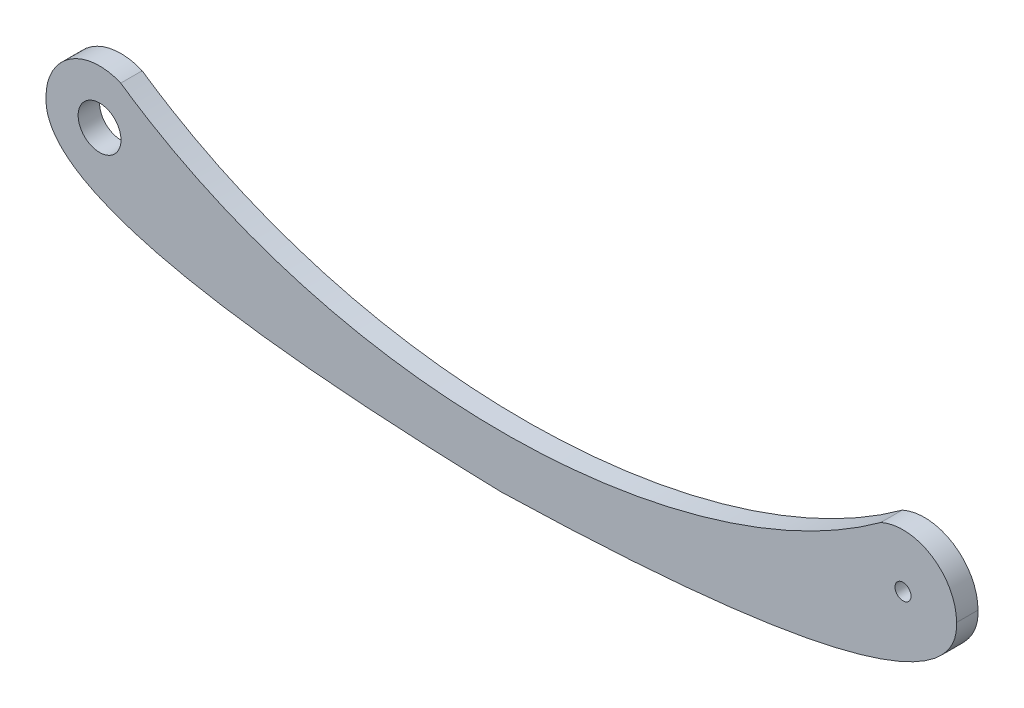
ISO-10303-21;
HEADER;
FILE_DESCRIPTION(('STEP AP214'),'2;1');
FILE_NAME('part.step','',(''),(''),'','','');
FILE_SCHEMA(('AUTOMOTIVE_DESIGN { 1 0 10303 214 1 1 1 1 }'));
ENDSEC;
DATA;
#1=APPLICATION_CONTEXT('core data for automotive mechanical design processes');
#2=APPLICATION_PROTOCOL_DEFINITION('international standard','automotive_design',2000,#1);
#3=PRODUCT_CONTEXT('',#1,'mechanical');
#4=PRODUCT('Part','Part','',(#3));
#5=PRODUCT_RELATED_PRODUCT_CATEGORY('part','',(#4));
#6=PRODUCT_DEFINITION_FORMATION('','',#4);
#7=PRODUCT_DEFINITION_CONTEXT('part definition',#1,'design');
#8=PRODUCT_DEFINITION('design','',#6,#7);
#9=PRODUCT_DEFINITION_SHAPE('','',#8);
#10=(LENGTH_UNIT() NAMED_UNIT(*) SI_UNIT(.MILLI.,.METRE.));
#11=(NAMED_UNIT(*) PLANE_ANGLE_UNIT() SI_UNIT($,.RADIAN.));
#12=(NAMED_UNIT(*) SI_UNIT($,.STERADIAN.) SOLID_ANGLE_UNIT());
#13=UNCERTAINTY_MEASURE_WITH_UNIT(LENGTH_MEASURE(1.E-05),#10,'distance_accuracy_value','');
#14=(GEOMETRIC_REPRESENTATION_CONTEXT(3) GLOBAL_UNCERTAINTY_ASSIGNED_CONTEXT((#13)) GLOBAL_UNIT_ASSIGNED_CONTEXT((#10,
#11,#12)) REPRESENTATION_CONTEXT('',''));
#15=CARTESIAN_POINT('',(0.,0.,0.));
#16=DIRECTION('',(0.,0.,1.));
#17=DIRECTION('',(1.,0.,0.));
#18=AXIS2_PLACEMENT_3D('',#15,#16,#17);
#19=CARTESIAN_POINT('',(10.8048928814692,-14.9181599133934,4.));
#20=DIRECTION('',(0.,0.,-1.));
#21=DIRECTION('',(-1.,0.,0.));
#22=AXIS2_PLACEMENT_3D('',#19,#20,#21);
#23=PLANE('',#22);
#24=CARTESIAN_POINT('',(-9.99999999999674,0.,4.));
#25=CARTESIAN_POINT('',(-10.8902142370632,-19.1353413607899,4.));
#26=CARTESIAN_POINT('',(75.0000000000002,-21.4019569319938,4.));
#27=B_SPLINE_CURVE_WITH_KNOTS('',2,(#24,#25,#26),.UNSPECIFIED.,.F.,.F.,(3,3),(0.,1.),.UNSPECIFIED.);
#28=CARTESIAN_POINT('',(-9.99999999999674,0.,4.));
#29=VERTEX_POINT('',#28);
#30=CARTESIAN_POINT('',(74.9999999999998,-21.4019569319938,4.));
#31=VERTEX_POINT('',#30);
#32=EDGE_CURVE('E128',#29,#31,#27,.T.);
#33=ORIENTED_EDGE('',*,*,#32,.T.);
#34=CARTESIAN_POINT('',(74.9999999999998,-21.4019569319938,4.));
#35=CARTESIAN_POINT('',(160.890214237063,-19.1353413607899,4.));
#36=CARTESIAN_POINT('',(159.999999999997,0.,4.));
#37=B_SPLINE_CURVE_WITH_KNOTS('',2,(#34,#35,#36),.UNSPECIFIED.,.F.,.F.,(3,3),(0.,1.),.UNSPECIFIED.);
#38=CARTESIAN_POINT('',(159.999999999997,0.,4.));
#39=VERTEX_POINT('',#38);
#40=EDGE_CURVE('E86',#31,#39,#37,.T.);
#41=ORIENTED_EDGE('',*,*,#40,.T.);
#42=CARTESIAN_POINT('',(150.,0.,4.));
#43=DIRECTION('',(0.,0.,1.));
#44=DIRECTION('',(1.,0.,0.));
#45=AXIS2_PLACEMENT_3D('',#42,#43,#44);
#46=CIRCLE('',#45,9.99999999999674);
#47=CARTESIAN_POINT('',(145.865990445887,9.10549092616315,4.));
#48=VERTEX_POINT('',#47);
#49=EDGE_CURVE('E90',#39,#48,#46,.T.);
#50=ORIENTED_EDGE('',*,*,#49,.T.);
#51=CARTESIAN_POINT('',(145.865990445887,9.10549092616315,4.));
#52=CARTESIAN_POINT('',(110.551742639104,-16.7070402195439,4.));
#53=CARTESIAN_POINT('',(46.9064884555261,-20.3737462545654,4.));
#54=CARTESIAN_POINT('',(3.94804782574258,9.18765031798577,4.));
#55=B_SPLINE_CURVE_WITH_KNOTS('',3,(#51,#52,#53,#54),.UNSPECIFIED.,.F.,.F.,(4,4),
(0.0224489478043279,0.850781245648387),.UNSPECIFIED.);
#56=CARTESIAN_POINT('',(3.94804782574258,9.18765031798577,4.));
#57=VERTEX_POINT('',#56);
#58=EDGE_CURVE('E94',#48,#57,#55,.T.);
#59=ORIENTED_EDGE('',*,*,#58,.T.);
#60=CARTESIAN_POINT('',(0.,0.,4.));
#61=DIRECTION('',(0.,0.,1.));
#62=DIRECTION('',(1.,0.,0.));
#63=AXIS2_PLACEMENT_3D('',#60,#61,#62);
#64=CIRCLE('',#63,9.99999999999674);
#65=EDGE_CURVE('E52',#57,#29,#64,.T.);
#66=ORIENTED_EDGE('',*,*,#65,.T.);
#67=EDGE_LOOP('',(#33,#41,#50,#59,#66));
#68=FACE_BOUND('',#67,.T.);
#69=CARTESIAN_POINT('',(0.,0.,4.));
#70=DIRECTION('',(0.,0.,1.));
#71=DIRECTION('',(1.,0.,0.));
#72=AXIS2_PLACEMENT_3D('',#69,#70,#71);
#73=CIRCLE('',#72,4.);
#74=CARTESIAN_POINT('',(4.,0.,4.));
#75=VERTEX_POINT('',#74);
#76=EDGE_CURVE('E142',#75,#75,#73,.T.);
#77=ORIENTED_EDGE('',*,*,#76,.F.);
#78=EDGE_LOOP('',(#77));
#79=FACE_BOUND('',#78,.T.);
#80=CARTESIAN_POINT('',(150.,0.,4.));
#81=DIRECTION('',(0.,0.,1.));
#82=DIRECTION('',(1.,0.,0.));
#83=AXIS2_PLACEMENT_3D('',#80,#81,#82);
#84=CIRCLE('',#83,1.5);
#85=CARTESIAN_POINT('',(151.5,0.,4.));
#86=VERTEX_POINT('',#85);
#87=EDGE_CURVE('E143',#86,#86,#84,.T.);
#88=ORIENTED_EDGE('',*,*,#87,.F.);
#89=EDGE_LOOP('',(#88));
#90=FACE_BOUND('',#89,.T.);
#91=ADVANCED_FACE('F34',(#68,#79,#90),#23,.F.);
#92=CARTESIAN_POINT('',(10.8048928814692,-14.9181599133934,0.));
#93=DIRECTION('',(0.,0.,-1.));
#94=DIRECTION('',(-1.,0.,0.));
#95=AXIS2_PLACEMENT_3D('',#92,#93,#94);
#96=PLANE('',#95);
#97=CARTESIAN_POINT('',(0.,0.,0.));
#98=DIRECTION('',(0.,0.,1.));
#99=DIRECTION('',(1.,0.,0.));
#100=AXIS2_PLACEMENT_3D('',#97,#98,#99);
#101=CIRCLE('',#100,4.);
#102=CARTESIAN_POINT('',(4.,0.,0.));
#103=VERTEX_POINT('',#102);
#104=EDGE_CURVE('E136',#103,#103,#101,.T.);
#105=ORIENTED_EDGE('',*,*,#104,.T.);
#106=EDGE_LOOP('',(#105));
#107=FACE_BOUND('',#106,.T.);
#108=CARTESIAN_POINT('',(-9.99999999999674,0.,0.));
#109=CARTESIAN_POINT('',(-10.8902142370632,-19.1353413607899,0.));
#110=CARTESIAN_POINT('',(75.0000000000002,-21.4019569319938,0.));
#111=B_SPLINE_CURVE_WITH_KNOTS('',2,(#108,#109,#110),.UNSPECIFIED.,.F.,.F.,(3,3),(0.,1.),.UNSPECIFIED.);
#112=CARTESIAN_POINT('',(-9.99999999999674,0.,0.));
#113=VERTEX_POINT('',#112);
#114=CARTESIAN_POINT('',(74.9999999999998,-21.4019569319938,0.));
#115=VERTEX_POINT('',#114);
#116=EDGE_CURVE('E146',#113,#115,#111,.T.);
#117=ORIENTED_EDGE('',*,*,#116,.F.);
#118=CARTESIAN_POINT('',(0.,0.,0.));
#119=DIRECTION('',(0.,0.,1.));
#120=DIRECTION('',(1.,0.,0.));
#121=AXIS2_PLACEMENT_3D('',#118,#119,#120);
#122=CIRCLE('',#121,9.99999999999674);
#123=CARTESIAN_POINT('',(3.94804782574258,9.18765031798577,0.));
#124=VERTEX_POINT('',#123);
#125=EDGE_CURVE('E78',#124,#113,#122,.T.);
#126=ORIENTED_EDGE('',*,*,#125,.F.);
#127=CARTESIAN_POINT('',(145.865990445887,9.10549092616315,0.));
#128=CARTESIAN_POINT('',(110.551742639104,-16.7070402195439,0.));
#129=CARTESIAN_POINT('',(46.9064884555261,-20.3737462545654,0.));
#130=CARTESIAN_POINT('',(3.94804782574258,9.18765031798577,0.));
#131=B_SPLINE_CURVE_WITH_KNOTS('',3,(#127,#128,#129,#130),.UNSPECIFIED.,.F.,.F.,(4,4),
(0.0224489478043279,0.850781245648387),.UNSPECIFIED.);
#132=CARTESIAN_POINT('',(145.865990445887,9.10549092616315,0.));
#133=VERTEX_POINT('',#132);
#134=EDGE_CURVE('E72',#133,#124,#131,.T.);
#135=ORIENTED_EDGE('',*,*,#134,.F.);
#136=CARTESIAN_POINT('',(150.,0.,0.));
#137=DIRECTION('',(0.,0.,1.));
#138=DIRECTION('',(1.,0.,0.));
#139=AXIS2_PLACEMENT_3D('',#136,#137,#138);
#140=CIRCLE('',#139,9.99999999999674);
#141=CARTESIAN_POINT('',(159.999999999997,0.,0.));
#142=VERTEX_POINT('',#141);
#143=EDGE_CURVE('E101',#142,#133,#140,.T.);
#144=ORIENTED_EDGE('',*,*,#143,.F.);
#145=CARTESIAN_POINT('',(74.9999999999998,-21.4019569319938,0.));
#146=CARTESIAN_POINT('',(160.890214237063,-19.1353413607899,0.));
#147=CARTESIAN_POINT('',(159.999999999997,0.,0.));
#148=B_SPLINE_CURVE_WITH_KNOTS('',2,(#145,#146,#147),.UNSPECIFIED.,.F.,.F.,(3,3),(0.,1.),.UNSPECIFIED.);
#149=EDGE_CURVE('E229',#115,#142,#148,.T.);
#150=ORIENTED_EDGE('',*,*,#149,.F.);
#151=EDGE_LOOP('',(#117,#126,#135,#144,#150));
#152=FACE_BOUND('',#151,.T.);
#153=CARTESIAN_POINT('',(150.,0.,0.));
#154=DIRECTION('',(0.,0.,1.));
#155=DIRECTION('',(1.,0.,0.));
#156=AXIS2_PLACEMENT_3D('',#153,#154,#155);
#157=CIRCLE('',#156,1.5);
#158=CARTESIAN_POINT('',(151.5,0.,0.));
#159=VERTEX_POINT('',#158);
#160=EDGE_CURVE('E147',#159,#159,#157,.T.);
#161=ORIENTED_EDGE('',*,*,#160,.T.);
#162=EDGE_LOOP('',(#161));
#163=FACE_BOUND('',#162,.T.);
#164=ADVANCED_FACE('F157',(#107,#152,#163),#96,.T.);
#165=DIRECTION('',(0.,0.,-1.));
#166=VECTOR('',#165,1.);
#167=SURFACE_OF_LINEAR_EXTRUSION('',#27,#166);
#168=ORIENTED_EDGE('',*,*,#116,.T.);
#169=DIRECTION('',(0.,0.,-1.));
#170=VECTOR('',#169,1.);
#171=CARTESIAN_POINT('',(74.9999999999998,-21.4019569319938,4.));
#172=LINE('',#171,#170);
#173=EDGE_CURVE('E11',#31,#115,#172,.T.);
#174=ORIENTED_EDGE('',*,*,#173,.F.);
#175=ORIENTED_EDGE('',*,*,#32,.F.);
#176=DIRECTION('',(0.,0.,-1.));
#177=VECTOR('',#176,1.);
#178=CARTESIAN_POINT('',(-9.99999999999674,0.,4.));
#179=LINE('',#178,#177);
#180=EDGE_CURVE('E106',#29,#113,#179,.T.);
#181=ORIENTED_EDGE('',*,*,#180,.T.);
#182=EDGE_LOOP('',(#168,#174,#175,#181));
#183=FACE_BOUND('',#182,.T.);
#184=ADVANCED_FACE('F36',(#183),#167,.F.);
#185=DIRECTION('',(0.,0.,-1.));
#186=VECTOR('',#185,1.);
#187=SURFACE_OF_LINEAR_EXTRUSION('',#37,#186);
#188=ORIENTED_EDGE('',*,*,#149,.T.);
#189=DIRECTION('',(0.,0.,-1.));
#190=VECTOR('',#189,1.);
#191=CARTESIAN_POINT('',(159.999999999997,0.,4.));
#192=LINE('',#191,#190);
#193=EDGE_CURVE('E44',#39,#142,#192,.T.);
#194=ORIENTED_EDGE('',*,*,#193,.F.);
#195=ORIENTED_EDGE('',*,*,#40,.F.);
#196=ORIENTED_EDGE('',*,*,#173,.T.);
#197=EDGE_LOOP('',(#188,#194,#195,#196));
#198=FACE_BOUND('',#197,.T.);
#199=ADVANCED_FACE('F123',(#198),#187,.F.);
#200=CARTESIAN_POINT('',(150.,0.,4.));
#201=DIRECTION('',(0.,0.,-1.));
#202=DIRECTION('',(-1.,0.,0.));
#203=AXIS2_PLACEMENT_3D('',#200,#201,#202);
#204=CYLINDRICAL_SURFACE('',#203,9.99999999999674);
#205=ORIENTED_EDGE('',*,*,#143,.T.);
#206=DIRECTION('',(0.,0.,-1.));
#207=VECTOR('',#206,1.);
#208=CARTESIAN_POINT('',(145.865990445887,9.10549092616315,4.));
#209=LINE('',#208,#207);
#210=EDGE_CURVE('E98',#48,#133,#209,.T.);
#211=ORIENTED_EDGE('',*,*,#210,.F.);
#212=ORIENTED_EDGE('',*,*,#49,.F.);
#213=ORIENTED_EDGE('',*,*,#193,.T.);
#214=EDGE_LOOP('',(#205,#211,#212,#213));
#215=FACE_BOUND('',#214,.T.);
#216=ADVANCED_FACE('F99',(#215),#204,.T.);
#217=DIRECTION('',(0.,0.,-1.));
#218=VECTOR('',#217,1.);
#219=SURFACE_OF_LINEAR_EXTRUSION('',#55,#218);
#220=ORIENTED_EDGE('',*,*,#134,.T.);
#221=DIRECTION('',(0.,0.,-1.));
#222=VECTOR('',#221,1.);
#223=CARTESIAN_POINT('',(3.94804782574258,9.18765031798577,4.));
#224=LINE('',#223,#222);
#225=EDGE_CURVE('E102',#57,#124,#224,.T.);
#226=ORIENTED_EDGE('',*,*,#225,.F.);
#227=ORIENTED_EDGE('',*,*,#58,.F.);
#228=ORIENTED_EDGE('',*,*,#210,.T.);
#229=EDGE_LOOP('',(#220,#226,#227,#228));
#230=FACE_BOUND('',#229,.T.);
#231=ADVANCED_FACE('F104',(#230),#219,.F.);
#232=CARTESIAN_POINT('',(0.,0.,4.));
#233=DIRECTION('',(0.,0.,-1.));
#234=DIRECTION('',(-1.,0.,0.));
#235=AXIS2_PLACEMENT_3D('',#232,#233,#234);
#236=CYLINDRICAL_SURFACE('',#235,9.99999999999674);
#237=ORIENTED_EDGE('',*,*,#125,.T.);
#238=ORIENTED_EDGE('',*,*,#180,.F.);
#239=ORIENTED_EDGE('',*,*,#65,.F.);
#240=ORIENTED_EDGE('',*,*,#225,.T.);
#241=EDGE_LOOP('',(#237,#238,#239,#240));
#242=FACE_BOUND('',#241,.T.);
#243=ADVANCED_FACE('F120',(#242),#236,.T.);
#244=CARTESIAN_POINT('',(0.,0.,4.));
#245=DIRECTION('',(0.,0.,-1.));
#246=DIRECTION('',(-1.,0.,0.));
#247=AXIS2_PLACEMENT_3D('',#244,#245,#246);
#248=CYLINDRICAL_SURFACE('',#247,4.);
#249=ORIENTED_EDGE('',*,*,#76,.T.);
#250=EDGE_LOOP('',(#249));
#251=FACE_BOUND('',#250,.T.);
#252=ORIENTED_EDGE('',*,*,#104,.F.);
#253=EDGE_LOOP('',(#252));
#254=FACE_BOUND('',#253,.T.);
#255=ADVANCED_FACE('F164',(#251,#254),#248,.F.);
#256=CARTESIAN_POINT('',(150.,0.,4.));
#257=DIRECTION('',(0.,0.,-1.));
#258=DIRECTION('',(-1.,0.,0.));
#259=AXIS2_PLACEMENT_3D('',#256,#257,#258);
#260=CYLINDRICAL_SURFACE('',#259,1.5);
#261=ORIENTED_EDGE('',*,*,#87,.T.);
#262=EDGE_LOOP('',(#261));
#263=FACE_BOUND('',#262,.T.);
#264=ORIENTED_EDGE('',*,*,#160,.F.);
#265=EDGE_LOOP('',(#264));
#266=FACE_BOUND('',#265,.T.);
#267=ADVANCED_FACE('F153',(#263,#266),#260,.F.);
#268=CLOSED_SHELL('',(#91,#164,#184,#199,#216,#231,#243,#255,#267));
#269=MANIFOLD_SOLID_BREP('B2',#268);
#270=ADVANCED_BREP_SHAPE_REPRESENTATION('',(#18,#269),#14);
#271=SHAPE_DEFINITION_REPRESENTATION(#9,#270);
ENDSEC;
END-ISO-10303-21;
